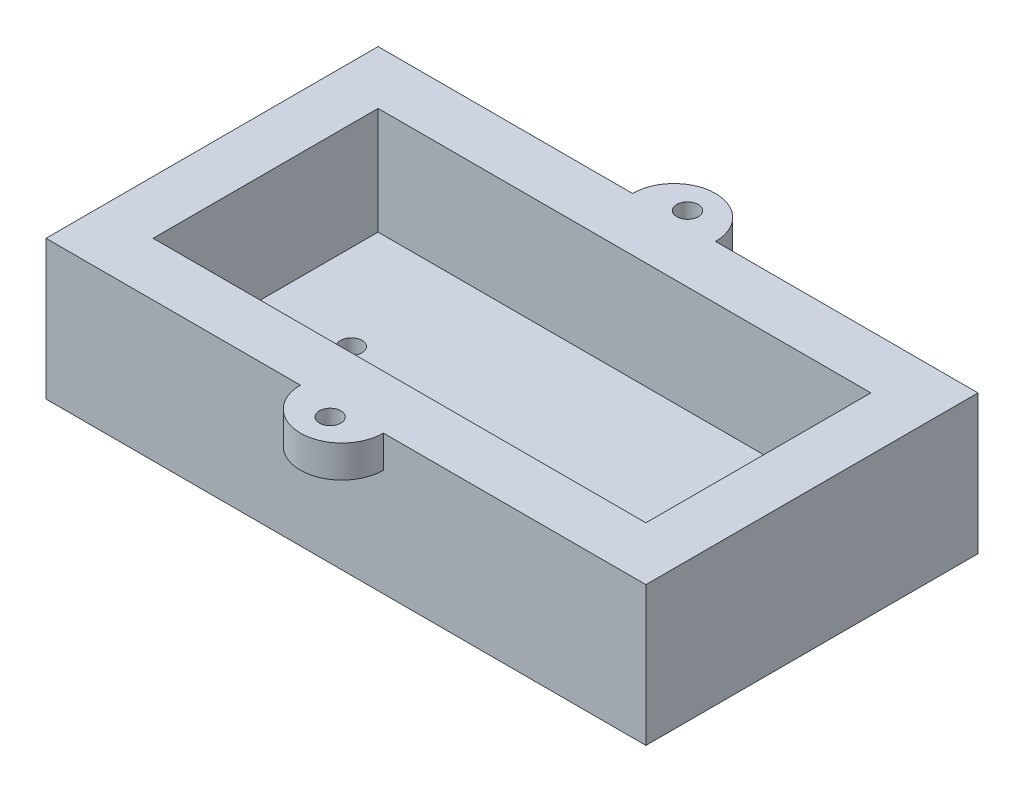
ISO-10303-21;
HEADER;
FILE_DESCRIPTION(('STEP AP214'),'2;1');
FILE_NAME('part.step','',(''),(''),'','','');
FILE_SCHEMA(('AUTOMOTIVE_DESIGN { 1 0 10303 214 1 1 1 1 }'));
ENDSEC;
DATA;
#1=APPLICATION_CONTEXT('core data for automotive mechanical design processes');
#2=APPLICATION_PROTOCOL_DEFINITION('international standard','automotive_design',2000,#1);
#3=PRODUCT_CONTEXT('',#1,'mechanical');
#4=PRODUCT('Part','Part','',(#3));
#5=PRODUCT_RELATED_PRODUCT_CATEGORY('part','',(#4));
#6=PRODUCT_DEFINITION_FORMATION('','',#4);
#7=PRODUCT_DEFINITION_CONTEXT('part definition',#1,'design');
#8=PRODUCT_DEFINITION('design','',#6,#7);
#9=PRODUCT_DEFINITION_SHAPE('','',#8);
#10=(LENGTH_UNIT() NAMED_UNIT(*) SI_UNIT(.MILLI.,.METRE.));
#11=(NAMED_UNIT(*) PLANE_ANGLE_UNIT() SI_UNIT($,.RADIAN.));
#12=(NAMED_UNIT(*) SI_UNIT($,.STERADIAN.) SOLID_ANGLE_UNIT());
#13=UNCERTAINTY_MEASURE_WITH_UNIT(LENGTH_MEASURE(1.E-05),#10,'distance_accuracy_value','');
#14=(GEOMETRIC_REPRESENTATION_CONTEXT(3) GLOBAL_UNCERTAINTY_ASSIGNED_CONTEXT((#13)) GLOBAL_UNIT_ASSIGNED_CONTEXT((#10,
#11,#12)) REPRESENTATION_CONTEXT('',''));
#15=CARTESIAN_POINT('',(0.,0.,0.));
#16=DIRECTION('',(0.,0.,1.));
#17=DIRECTION('',(1.,0.,0.));
#18=AXIS2_PLACEMENT_3D('',#15,#16,#17);
#19=CARTESIAN_POINT('',(0.,3.,0.));
#20=DIRECTION('',(0.,-1.,0.));
#21=DIRECTION('',(0.,0.,-1.));
#22=AXIS2_PLACEMENT_3D('',#19,#20,#21);
#23=PLANE('',#22);
#24=CARTESIAN_POINT('',(-9.8360655737705,3.,-4.66393442622951));
#25=DIRECTION('',(0.,1.,0.));
#26=DIRECTION('',(0.,0.,1.));
#27=AXIS2_PLACEMENT_3D('',#24,#25,#26);
#28=CIRCLE('',#27,1.);
#29=CARTESIAN_POINT('',(-9.8360655737705,3.,-3.66393442622951));
#30=VERTEX_POINT('',#29);
#31=EDGE_CURVE('E219',#30,#30,#28,.T.);
#32=ORIENTED_EDGE('',*,*,#31,.F.);
#33=EDGE_LOOP('',(#32));
#34=FACE_BOUND('',#33,.T.);
#35=CARTESIAN_POINT('',(20.1639344262295,3.,-4.66393442622952));
#36=DIRECTION('',(0.,1.,0.));
#37=DIRECTION('',(0.,0.,-1.));
#38=AXIS2_PLACEMENT_3D('',#35,#36,#37);
#39=CIRCLE('',#38,1.);
#40=CARTESIAN_POINT('',(20.1639344262295,3.,-5.66393442622952));
#41=VERTEX_POINT('',#40);
#42=EDGE_CURVE('E225',#41,#41,#39,.T.);
#43=ORIENTED_EDGE('',*,*,#42,.F.);
#44=EDGE_LOOP('',(#43));
#45=FACE_BOUND('',#44,.T.);
#46=DIRECTION('',(1.,0.,0.));
#47=VECTOR('',#46,1.);
#48=CARTESIAN_POINT('',(-17.8360655737705,3.,5.83606557377048));
#49=LINE('',#48,#47);
#50=CARTESIAN_POINT('',(-17.8360655737705,3.,5.83606557377048));
#51=VERTEX_POINT('',#50);
#52=CARTESIAN_POINT('',(28.1639344262295,3.,5.83606557377048));
#53=VERTEX_POINT('',#52);
#54=EDGE_CURVE('E211',#51,#53,#49,.T.);
#55=ORIENTED_EDGE('',*,*,#54,.T.);
#56=DIRECTION('',(0.,0.,1.));
#57=VECTOR('',#56,1.);
#58=CARTESIAN_POINT('',(28.1639344262295,3.,-15.1639344262295));
#59=LINE('',#58,#57);
#60=CARTESIAN_POINT('',(28.1639344262295,3.,-15.1639344262295));
#61=VERTEX_POINT('',#60);
#62=EDGE_CURVE('E213',#61,#53,#59,.T.);
#63=ORIENTED_EDGE('',*,*,#62,.F.);
#64=DIRECTION('',(1.,0.,0.));
#65=VECTOR('',#64,1.);
#66=CARTESIAN_POINT('',(-17.8360655737705,3.,-15.1639344262295));
#67=LINE('',#66,#65);
#68=CARTESIAN_POINT('',(-17.8360655737705,3.,-15.1639344262295));
#69=VERTEX_POINT('',#68);
#70=EDGE_CURVE('E47',#69,#61,#67,.T.);
#71=ORIENTED_EDGE('',*,*,#70,.F.);
#72=DIRECTION('',(0.,0.,1.));
#73=VECTOR('',#72,1.);
#74=CARTESIAN_POINT('',(-17.8360655737705,3.,-15.1639344262295));
#75=LINE('',#74,#73);
#76=EDGE_CURVE('E11',#69,#51,#75,.T.);
#77=ORIENTED_EDGE('',*,*,#76,.T.);
#78=EDGE_LOOP('',(#55,#63,#71,#77));
#79=FACE_BOUND('',#78,.T.);
#80=ADVANCED_FACE('F38',(#34,#45,#79),#23,.F.);
#81=CARTESIAN_POINT('',(-17.8360655737705,13.,-15.1639344262295));
#82=DIRECTION('',(1.,0.,0.));
#83=DIRECTION('',(0.,0.,-1.));
#84=AXIS2_PLACEMENT_3D('',#81,#82,#83);
#85=PLANE('',#84);
#86=ORIENTED_EDGE('',*,*,#76,.F.);
#87=DIRECTION('',(0.,-1.,0.));
#88=VECTOR('',#87,1.);
#89=CARTESIAN_POINT('',(-17.8360655737705,13.,-15.1639344262295));
#90=LINE('',#89,#88);
#91=CARTESIAN_POINT('',(-17.8360655737705,13.,-15.1639344262295));
#92=VERTEX_POINT('',#91);
#93=EDGE_CURVE('E168',#92,#69,#90,.T.);
#94=ORIENTED_EDGE('',*,*,#93,.F.);
#95=DIRECTION('',(0.,0.,1.));
#96=VECTOR('',#95,1.);
#97=CARTESIAN_POINT('',(-17.8360655737705,13.,-15.1639344262295));
#98=LINE('',#97,#96);
#99=CARTESIAN_POINT('',(-17.8360655737705,13.,5.83606557377048));
#100=VERTEX_POINT('',#99);
#101=EDGE_CURVE('E158',#92,#100,#98,.T.);
#102=ORIENTED_EDGE('',*,*,#101,.T.);
#103=DIRECTION('',(0.,-1.,0.));
#104=VECTOR('',#103,1.);
#105=CARTESIAN_POINT('',(-17.8360655737705,13.,5.83606557377048));
#106=LINE('',#105,#104);
#107=EDGE_CURVE('E177',#100,#51,#106,.T.);
#108=ORIENTED_EDGE('',*,*,#107,.T.);
#109=EDGE_LOOP('',(#86,#94,#102,#108));
#110=FACE_BOUND('',#109,.T.);
#111=ADVANCED_FACE('F271',(#110),#85,.T.);
#112=CARTESIAN_POINT('',(-17.8360655737705,13.,5.83606557377048));
#113=DIRECTION('',(0.,0.,-1.));
#114=DIRECTION('',(-1.,0.,0.));
#115=AXIS2_PLACEMENT_3D('',#112,#113,#114);
#116=PLANE('',#115);
#117=ORIENTED_EDGE('',*,*,#54,.F.);
#118=ORIENTED_EDGE('',*,*,#107,.F.);
#119=DIRECTION('',(1.,0.,0.));
#120=VECTOR('',#119,1.);
#121=CARTESIAN_POINT('',(-17.8360655737705,13.,5.83606557377048));
#122=LINE('',#121,#120);
#123=CARTESIAN_POINT('',(28.1639344262295,13.,5.83606557377048));
#124=VERTEX_POINT('',#123);
#125=EDGE_CURVE('E161',#100,#124,#122,.T.);
#126=ORIENTED_EDGE('',*,*,#125,.T.);
#127=DIRECTION('',(0.,-1.,0.));
#128=VECTOR('',#127,1.);
#129=CARTESIAN_POINT('',(28.1639344262295,13.,5.83606557377048));
#130=LINE('',#129,#128);
#131=EDGE_CURVE('E174',#124,#53,#130,.T.);
#132=ORIENTED_EDGE('',*,*,#131,.T.);
#133=EDGE_LOOP('',(#117,#118,#126,#132));
#134=FACE_BOUND('',#133,.T.);
#135=ADVANCED_FACE('F263',(#134),#116,.T.);
#136=CARTESIAN_POINT('',(28.1639344262295,13.,-15.1639344262295));
#137=DIRECTION('',(-1.,0.,0.));
#138=DIRECTION('',(0.,0.,1.));
#139=AXIS2_PLACEMENT_3D('',#136,#137,#138);
#140=PLANE('',#139);
#141=ORIENTED_EDGE('',*,*,#62,.T.);
#142=ORIENTED_EDGE('',*,*,#131,.F.);
#143=DIRECTION('',(0.,0.,-1.));
#144=VECTOR('',#143,1.);
#145=CARTESIAN_POINT('',(28.1639344262295,13.,-15.1639344262295));
#146=LINE('',#145,#144);
#147=CARTESIAN_POINT('',(28.1639344262295,13.,-15.1639344262295));
#148=VERTEX_POINT('',#147);
#149=EDGE_CURVE('E163',#124,#148,#146,.T.);
#150=ORIENTED_EDGE('',*,*,#149,.T.);
#151=DIRECTION('',(0.,-1.,0.));
#152=VECTOR('',#151,1.);
#153=CARTESIAN_POINT('',(28.1639344262295,13.,-15.1639344262295));
#154=LINE('',#153,#152);
#155=EDGE_CURVE('E171',#148,#61,#154,.T.);
#156=ORIENTED_EDGE('',*,*,#155,.T.);
#157=EDGE_LOOP('',(#141,#142,#150,#156));
#158=FACE_BOUND('',#157,.T.);
#159=ADVANCED_FACE('F265',(#158),#140,.T.);
#160=CARTESIAN_POINT('',(-17.8360655737705,13.,-15.1639344262295));
#161=DIRECTION('',(0.,0.,1.));
#162=DIRECTION('',(1.,0.,0.));
#163=AXIS2_PLACEMENT_3D('',#160,#161,#162);
#164=PLANE('',#163);
#165=ORIENTED_EDGE('',*,*,#70,.T.);
#166=ORIENTED_EDGE('',*,*,#155,.F.);
#167=DIRECTION('',(-1.,0.,0.));
#168=VECTOR('',#167,1.);
#169=CARTESIAN_POINT('',(-17.8360655737705,13.,-15.1639344262295));
#170=LINE('',#169,#168);
#171=EDGE_CURVE('E166',#148,#92,#170,.T.);
#172=ORIENTED_EDGE('',*,*,#171,.T.);
#173=ORIENTED_EDGE('',*,*,#93,.T.);
#174=EDGE_LOOP('',(#165,#166,#172,#173));
#175=FACE_BOUND('',#174,.T.);
#176=ADVANCED_FACE('F249',(#175),#164,.T.);
#177=CARTESIAN_POINT('',(0.,13.,0.));
#178=DIRECTION('',(0.,1.,0.));
#179=DIRECTION('',(0.,0.,1.));
#180=AXIS2_PLACEMENT_3D('',#177,#178,#179);
#181=PLANE('',#180);
#182=CARTESIAN_POINT('',(4.86912384209859,13.,-21.3454881289863));
#183=DIRECTION('',(0.,1.,0.));
#184=DIRECTION('',(0.,0.,1.));
#185=AXIS2_PLACEMENT_3D('',#182,#183,#184);
#186=CIRCLE('',#185,1.);
#187=CARTESIAN_POINT('',(4.86912384209859,13.,-20.3454881289863));
#188=VERTEX_POINT('',#187);
#189=EDGE_CURVE('E235',#188,#188,#186,.T.);
#190=ORIENTED_EDGE('',*,*,#189,.F.);
#191=EDGE_LOOP('',(#190));
#192=FACE_BOUND('',#191,.T.);
#193=CARTESIAN_POINT('',(4.86912384209859,13.,12.0176192765273));
#194=DIRECTION('',(0.,1.,0.));
#195=DIRECTION('',(0.,0.,-1.));
#196=AXIS2_PLACEMENT_3D('',#193,#194,#195);
#197=CIRCLE('',#196,1.);
#198=CARTESIAN_POINT('',(4.86912384209859,13.,11.0176192765273));
#199=VERTEX_POINT('',#198);
#200=EDGE_CURVE('E223',#199,#199,#197,.T.);
#201=ORIENTED_EDGE('',*,*,#200,.F.);
#202=EDGE_LOOP('',(#201));
#203=FACE_BOUND('',#202,.T.);
#204=DIRECTION('',(0.,0.,1.));
#205=VECTOR('',#204,1.);
#206=CARTESIAN_POINT('',(-22.8360655737705,13.,-20.1639344262295));
#207=LINE('',#206,#205);
#208=CARTESIAN_POINT('',(-22.8360655737705,13.,-20.1639344262295));
#209=VERTEX_POINT('',#208);
#210=CARTESIAN_POINT('',(-22.8360655737705,13.,10.8360655737705));
#211=VERTEX_POINT('',#210);
#212=EDGE_CURVE('E181',#209,#211,#207,.T.);
#213=ORIENTED_EDGE('',*,*,#212,.T.);
#214=DIRECTION('',(1.,0.,0.));
#215=VECTOR('',#214,1.);
#216=CARTESIAN_POINT('',(-22.8360655737705,13.,10.8360655737705));
#217=LINE('',#216,#215);
#218=CARTESIAN_POINT('',(0.913554245757848,13.,10.8360655737705));
#219=VERTEX_POINT('',#218);
#220=EDGE_CURVE('E185',#211,#219,#217,.T.);
#221=ORIENTED_EDGE('',*,*,#220,.T.);
#222=CARTESIAN_POINT('',(4.78890088089376,13.,10.8360655737705));
#223=DIRECTION('',(0.,1.,0.));
#224=DIRECTION('',(0.,0.,1.));
#225=AXIS2_PLACEMENT_3D('',#222,#223,#224);
#226=CIRCLE('',#225,3.87534663513591);
#227=CARTESIAN_POINT('',(8.66424751602968,13.,10.8360655737705));
#228=VERTEX_POINT('',#227);
#229=EDGE_CURVE('E55',#219,#228,#226,.T.);
#230=ORIENTED_EDGE('',*,*,#229,.T.);
#231=CARTESIAN_POINT('',(33.1639344262295,13.,10.8360655737705));
#232=VERTEX_POINT('',#231);
#233=EDGE_CURVE('E143',#228,#232,#217,.T.);
#234=ORIENTED_EDGE('',*,*,#233,.T.);
#235=DIRECTION('',(0.,0.,-1.));
#236=VECTOR('',#235,1.);
#237=CARTESIAN_POINT('',(33.1639344262295,13.,-20.1639344262295));
#238=LINE('',#237,#236);
#239=CARTESIAN_POINT('',(33.1639344262295,13.,-20.1639344262295));
#240=VERTEX_POINT('',#239);
#241=EDGE_CURVE('E187',#232,#240,#238,.T.);
#242=ORIENTED_EDGE('',*,*,#241,.T.);
#243=DIRECTION('',(-1.,0.,0.));
#244=VECTOR('',#243,1.);
#245=CARTESIAN_POINT('',(-22.8360655737705,13.,-20.1639344262295));
#246=LINE('',#245,#244);
#247=CARTESIAN_POINT('',(8.66424751602968,13.,-20.1639344262295));
#248=VERTEX_POINT('',#247);
#249=EDGE_CURVE('E190',#240,#248,#246,.T.);
#250=ORIENTED_EDGE('',*,*,#249,.T.);
#251=CARTESIAN_POINT('',(4.78890088089376,13.,-20.1639344262295));
#252=DIRECTION('',(0.,1.,0.));
#253=DIRECTION('',(0.,0.,-1.));
#254=AXIS2_PLACEMENT_3D('',#251,#252,#253);
#255=CIRCLE('',#254,3.87534663513591);
#256=CARTESIAN_POINT('',(0.913554245757848,13.,-20.1639344262295));
#257=VERTEX_POINT('',#256);
#258=EDGE_CURVE('E62',#248,#257,#255,.T.);
#259=ORIENTED_EDGE('',*,*,#258,.T.);
#260=EDGE_CURVE('E189',#257,#209,#246,.T.);
#261=ORIENTED_EDGE('',*,*,#260,.T.);
#262=EDGE_LOOP('',(#213,#221,#230,#234,#242,#250,#259,#261));
#263=FACE_BOUND('',#262,.T.);
#264=ORIENTED_EDGE('',*,*,#125,.F.);
#265=ORIENTED_EDGE('',*,*,#101,.F.);
#266=ORIENTED_EDGE('',*,*,#171,.F.);
#267=ORIENTED_EDGE('',*,*,#149,.F.);
#268=EDGE_LOOP('',(#264,#265,#266,#267));
#269=FACE_BOUND('',#268,.T.);
#270=ADVANCED_FACE('F246',(#192,#203,#263,#269),#181,.T.);
#271=CARTESIAN_POINT('',(-22.8360655737705,13.,-20.1639344262295));
#272=DIRECTION('',(1.,0.,0.));
#273=DIRECTION('',(0.,0.,-1.));
#274=AXIS2_PLACEMENT_3D('',#271,#272,#273);
#275=PLANE('',#274);
#276=DIRECTION('',(0.,0.,1.));
#277=VECTOR('',#276,1.);
#278=CARTESIAN_POINT('',(-22.8360655737705,0.,-20.1639344262295));
#279=LINE('',#278,#277);
#280=CARTESIAN_POINT('',(-22.8360655737705,0.,-20.1639344262295));
#281=VERTEX_POINT('',#280);
#282=CARTESIAN_POINT('',(-22.8360655737705,0.,10.8360655737705));
#283=VERTEX_POINT('',#282);
#284=EDGE_CURVE('E180',#281,#283,#279,.T.);
#285=ORIENTED_EDGE('',*,*,#284,.T.);
#286=DIRECTION('',(0.,-1.,0.));
#287=VECTOR('',#286,1.);
#288=CARTESIAN_POINT('',(-22.8360655737705,13.,10.8360655737705));
#289=LINE('',#288,#287);
#290=EDGE_CURVE('E208',#211,#283,#289,.T.);
#291=ORIENTED_EDGE('',*,*,#290,.F.);
#292=ORIENTED_EDGE('',*,*,#212,.F.);
#293=DIRECTION('',(0.,-1.,0.));
#294=VECTOR('',#293,1.);
#295=CARTESIAN_POINT('',(-22.8360655737705,13.,-20.1639344262295));
#296=LINE('',#295,#294);
#297=EDGE_CURVE('E192',#209,#281,#296,.T.);
#298=ORIENTED_EDGE('',*,*,#297,.T.);
#299=EDGE_LOOP('',(#285,#291,#292,#298));
#300=FACE_BOUND('',#299,.T.);
#301=ADVANCED_FACE('F248',(#300),#275,.F.);
#302=CARTESIAN_POINT('',(-22.8360655737705,13.,10.8360655737705));
#303=DIRECTION('',(0.,0.,-1.));
#304=DIRECTION('',(-1.,0.,0.));
#305=AXIS2_PLACEMENT_3D('',#302,#303,#304);
#306=PLANE('',#305);
#307=DIRECTION('',(-1.,0.,0.));
#308=VECTOR('',#307,1.);
#309=CARTESIAN_POINT('',(0.913554245757848,10.,10.8360655737705));
#310=LINE('',#309,#308);
#311=CARTESIAN_POINT('',(8.66424751602968,10.,10.8360655737705));
#312=VERTEX_POINT('',#311);
#313=CARTESIAN_POINT('',(0.913554245757848,10.,10.8360655737705));
#314=VERTEX_POINT('',#313);
#315=EDGE_CURVE('E136',#312,#314,#310,.T.);
#316=ORIENTED_EDGE('',*,*,#315,.T.);
#317=DIRECTION('',(0.,1.,0.));
#318=VECTOR('',#317,1.);
#319=CARTESIAN_POINT('',(0.913554245757848,10.,10.8360655737705));
#320=LINE('',#319,#318);
#321=EDGE_CURVE('E133',#314,#219,#320,.T.);
#322=ORIENTED_EDGE('',*,*,#321,.T.);
#323=ORIENTED_EDGE('',*,*,#220,.F.);
#324=ORIENTED_EDGE('',*,*,#290,.T.);
#325=DIRECTION('',(1.,0.,0.));
#326=VECTOR('',#325,1.);
#327=CARTESIAN_POINT('',(-22.8360655737705,0.,10.8360655737705));
#328=LINE('',#327,#326);
#329=CARTESIAN_POINT('',(33.1639344262295,0.,10.8360655737705));
#330=VERTEX_POINT('',#329);
#331=EDGE_CURVE('E195',#283,#330,#328,.T.);
#332=ORIENTED_EDGE('',*,*,#331,.T.);
#333=DIRECTION('',(0.,-1.,0.));
#334=VECTOR('',#333,1.);
#335=CARTESIAN_POINT('',(33.1639344262295,13.,10.8360655737705));
#336=LINE('',#335,#334);
#337=EDGE_CURVE('E205',#232,#330,#336,.T.);
#338=ORIENTED_EDGE('',*,*,#337,.F.);
#339=ORIENTED_EDGE('',*,*,#233,.F.);
#340=DIRECTION('',(0.,1.,0.));
#341=VECTOR('',#340,1.);
#342=CARTESIAN_POINT('',(8.66424751602968,10.,10.8360655737705));
#343=LINE('',#342,#341);
#344=EDGE_CURVE('E130',#312,#228,#343,.T.);
#345=ORIENTED_EDGE('',*,*,#344,.F.);
#346=EDGE_LOOP('',(#316,#322,#323,#324,#332,#338,#339,#345));
#347=FACE_BOUND('',#346,.T.);
#348=ADVANCED_FACE('F141',(#347),#306,.F.);
#349=CARTESIAN_POINT('',(33.1639344262295,13.,-20.1639344262295));
#350=DIRECTION('',(-1.,0.,0.));
#351=DIRECTION('',(0.,0.,1.));
#352=AXIS2_PLACEMENT_3D('',#349,#350,#351);
#353=PLANE('',#352);
#354=DIRECTION('',(0.,0.,-1.));
#355=VECTOR('',#354,1.);
#356=CARTESIAN_POINT('',(33.1639344262295,0.,-20.1639344262295));
#357=LINE('',#356,#355);
#358=CARTESIAN_POINT('',(33.1639344262295,0.,-20.1639344262295));
#359=VERTEX_POINT('',#358);
#360=EDGE_CURVE('E197',#330,#359,#357,.T.);
#361=ORIENTED_EDGE('',*,*,#360,.T.);
#362=DIRECTION('',(0.,-1.,0.));
#363=VECTOR('',#362,1.);
#364=CARTESIAN_POINT('',(33.1639344262295,13.,-20.1639344262295));
#365=LINE('',#364,#363);
#366=EDGE_CURVE('E202',#240,#359,#365,.T.);
#367=ORIENTED_EDGE('',*,*,#366,.F.);
#368=ORIENTED_EDGE('',*,*,#241,.F.);
#369=ORIENTED_EDGE('',*,*,#337,.T.);
#370=EDGE_LOOP('',(#361,#367,#368,#369));
#371=FACE_BOUND('',#370,.T.);
#372=ADVANCED_FACE('F285',(#371),#353,.F.);
#373=CARTESIAN_POINT('',(-22.8360655737705,13.,-20.1639344262295));
#374=DIRECTION('',(0.,0.,1.));
#375=DIRECTION('',(1.,0.,0.));
#376=AXIS2_PLACEMENT_3D('',#373,#374,#375);
#377=PLANE('',#376);
#378=DIRECTION('',(1.,0.,0.));
#379=VECTOR('',#378,1.);
#380=CARTESIAN_POINT('',(0.913554245757848,10.,-20.1639344262295));
#381=LINE('',#380,#379);
#382=CARTESIAN_POINT('',(0.913554245757848,10.,-20.1639344262295));
#383=VERTEX_POINT('',#382);
#384=CARTESIAN_POINT('',(8.66424751602968,10.,-20.1639344262295));
#385=VERTEX_POINT('',#384);
#386=EDGE_CURVE('E150',#383,#385,#381,.T.);
#387=ORIENTED_EDGE('',*,*,#386,.T.);
#388=DIRECTION('',(0.,1.,0.));
#389=VECTOR('',#388,1.);
#390=CARTESIAN_POINT('',(8.66424751602968,10.,-20.1639344262295));
#391=LINE('',#390,#389);
#392=EDGE_CURVE('E155',#385,#248,#391,.T.);
#393=ORIENTED_EDGE('',*,*,#392,.T.);
#394=ORIENTED_EDGE('',*,*,#249,.F.);
#395=ORIENTED_EDGE('',*,*,#366,.T.);
#396=DIRECTION('',(-1.,0.,0.));
#397=VECTOR('',#396,1.);
#398=CARTESIAN_POINT('',(-22.8360655737705,0.,-20.1639344262295));
#399=LINE('',#398,#397);
#400=EDGE_CURVE('E184',#359,#281,#399,.T.);
#401=ORIENTED_EDGE('',*,*,#400,.T.);
#402=ORIENTED_EDGE('',*,*,#297,.F.);
#403=ORIENTED_EDGE('',*,*,#260,.F.);
#404=DIRECTION('',(0.,1.,0.));
#405=VECTOR('',#404,1.);
#406=CARTESIAN_POINT('',(0.913554245757848,10.,-20.1639344262295));
#407=LINE('',#406,#405);
#408=EDGE_CURVE('E153',#383,#257,#407,.T.);
#409=ORIENTED_EDGE('',*,*,#408,.F.);
#410=EDGE_LOOP('',(#387,#393,#394,#395,#401,#402,#403,#409));
#411=FACE_BOUND('',#410,.T.);
#412=ADVANCED_FACE('F282',(#411),#377,.F.);
#413=CARTESIAN_POINT('',(0.,0.,0.));
#414=DIRECTION('',(0.,-1.,0.));
#415=DIRECTION('',(0.,0.,-1.));
#416=AXIS2_PLACEMENT_3D('',#413,#414,#415);
#417=PLANE('',#416);
#418=CARTESIAN_POINT('',(-9.8360655737705,0.,-4.66393442622951));
#419=DIRECTION('',(0.,-1.,0.));
#420=DIRECTION('',(0.,0.,-1.));
#421=AXIS2_PLACEMENT_3D('',#418,#419,#420);
#422=CIRCLE('',#421,1.);
#423=CARTESIAN_POINT('',(-9.8360655737705,0.,-5.66393442622951));
#424=VERTEX_POINT('',#423);
#425=EDGE_CURVE('E42',#424,#424,#422,.T.);
#426=ORIENTED_EDGE('',*,*,#425,.F.);
#427=EDGE_LOOP('',(#426));
#428=FACE_BOUND('',#427,.T.);
#429=CARTESIAN_POINT('',(20.1639344262295,0.,-4.66393442622952));
#430=DIRECTION('',(0.,-1.,0.));
#431=DIRECTION('',(0.,0.,-1.));
#432=AXIS2_PLACEMENT_3D('',#429,#430,#431);
#433=CIRCLE('',#432,1.);
#434=CARTESIAN_POINT('',(20.1639344262295,0.,-5.66393442622952));
#435=VERTEX_POINT('',#434);
#436=EDGE_CURVE('E217',#435,#435,#433,.T.);
#437=ORIENTED_EDGE('',*,*,#436,.F.);
#438=EDGE_LOOP('',(#437));
#439=FACE_BOUND('',#438,.T.);
#440=ORIENTED_EDGE('',*,*,#284,.F.);
#441=ORIENTED_EDGE('',*,*,#400,.F.);
#442=ORIENTED_EDGE('',*,*,#360,.F.);
#443=ORIENTED_EDGE('',*,*,#331,.F.);
#444=EDGE_LOOP('',(#440,#441,#442,#443));
#445=FACE_BOUND('',#444,.T.);
#446=ADVANCED_FACE('F40',(#428,#439,#445),#417,.T.);
#447=CARTESIAN_POINT('',(4.78890088089376,10.,-20.1639344262295));
#448=DIRECTION('',(0.,1.,0.));
#449=DIRECTION('',(0.,0.,1.));
#450=AXIS2_PLACEMENT_3D('',#447,#448,#449);
#451=CYLINDRICAL_SURFACE('',#450,3.87534663513591);
#452=ORIENTED_EDGE('',*,*,#258,.F.);
#453=ORIENTED_EDGE('',*,*,#392,.F.);
#454=CARTESIAN_POINT('',(4.78890088089376,10.,-20.1639344262295));
#455=DIRECTION('',(0.,1.,0.));
#456=DIRECTION('',(0.,0.,-1.));
#457=AXIS2_PLACEMENT_3D('',#454,#455,#456);
#458=CIRCLE('',#457,3.87534663513591);
#459=EDGE_CURVE('E148',#385,#383,#458,.T.);
#460=ORIENTED_EDGE('',*,*,#459,.T.);
#461=ORIENTED_EDGE('',*,*,#408,.T.);
#462=EDGE_LOOP('',(#452,#453,#460,#461));
#463=FACE_BOUND('',#462,.T.);
#464=ADVANCED_FACE('F308',(#463),#451,.T.);
#465=CARTESIAN_POINT('',(4.78890088089376,10.,-20.1639344262295));
#466=DIRECTION('',(0.,-1.,0.));
#467=DIRECTION('',(0.,0.,-1.));
#468=AXIS2_PLACEMENT_3D('',#465,#466,#467);
#469=PLANE('',#468);
#470=ORIENTED_EDGE('',*,*,#459,.F.);
#471=ORIENTED_EDGE('',*,*,#386,.F.);
#472=EDGE_LOOP('',(#470,#471));
#473=FACE_BOUND('',#472,.T.);
#474=ADVANCED_FACE('F310',(#473),#469,.T.);
#475=CARTESIAN_POINT('',(4.78890088089376,10.,10.8360655737705));
#476=DIRECTION('',(0.,1.,0.));
#477=DIRECTION('',(0.,0.,1.));
#478=AXIS2_PLACEMENT_3D('',#475,#476,#477);
#479=CYLINDRICAL_SURFACE('',#478,3.87534663513591);
#480=ORIENTED_EDGE('',*,*,#229,.F.);
#481=ORIENTED_EDGE('',*,*,#321,.F.);
#482=CARTESIAN_POINT('',(4.78890088089376,10.,10.8360655737705));
#483=DIRECTION('',(0.,1.,0.));
#484=DIRECTION('',(0.,0.,1.));
#485=AXIS2_PLACEMENT_3D('',#482,#483,#484);
#486=CIRCLE('',#485,3.87534663513591);
#487=EDGE_CURVE('E126',#314,#312,#486,.T.);
#488=ORIENTED_EDGE('',*,*,#487,.T.);
#489=ORIENTED_EDGE('',*,*,#344,.T.);
#490=EDGE_LOOP('',(#480,#481,#488,#489));
#491=FACE_BOUND('',#490,.T.);
#492=ADVANCED_FACE('F128',(#491),#479,.T.);
#493=CARTESIAN_POINT('',(4.78890088089376,10.,10.8360655737705));
#494=DIRECTION('',(0.,1.,0.));
#495=DIRECTION('',(0.,0.,1.));
#496=AXIS2_PLACEMENT_3D('',#493,#494,#495);
#497=PLANE('',#496);
#498=ORIENTED_EDGE('',*,*,#487,.F.);
#499=ORIENTED_EDGE('',*,*,#315,.F.);
#500=EDGE_LOOP('',(#498,#499));
#501=FACE_BOUND('',#500,.T.);
#502=ADVANCED_FACE('F138',(#501),#497,.F.);
#503=CARTESIAN_POINT('',(4.86912384209859,11.5,12.0176192765273));
#504=DIRECTION('',(0.,1.,0.));
#505=DIRECTION('',(0.,0.,1.));
#506=AXIS2_PLACEMENT_3D('',#503,#504,#505);
#507=CYLINDRICAL_SURFACE('',#506,1.);
#508=CARTESIAN_POINT('',(4.86912384209859,11.5,12.0176192765273));
#509=DIRECTION('',(0.,1.,0.));
#510=DIRECTION('',(0.,0.,-1.));
#511=AXIS2_PLACEMENT_3D('',#508,#509,#510);
#512=CIRCLE('',#511,1.);
#513=CARTESIAN_POINT('',(4.86912384209859,11.5,11.0176192765273));
#514=VERTEX_POINT('',#513);
#515=EDGE_CURVE('E238',#514,#514,#512,.T.);
#516=ORIENTED_EDGE('',*,*,#515,.F.);
#517=EDGE_LOOP('',(#516));
#518=FACE_BOUND('',#517,.T.);
#519=ORIENTED_EDGE('',*,*,#200,.T.);
#520=EDGE_LOOP('',(#519));
#521=FACE_BOUND('',#520,.T.);
#522=ADVANCED_FACE('F244',(#518,#521),#507,.F.);
#523=CARTESIAN_POINT('',(4.86912384209859,11.5,12.0176192765273));
#524=DIRECTION('',(0.,-1.,0.));
#525=DIRECTION('',(0.,0.,-1.));
#526=AXIS2_PLACEMENT_3D('',#523,#524,#525);
#527=PLANE('',#526);
#528=ORIENTED_EDGE('',*,*,#515,.T.);
#529=EDGE_LOOP('',(#528));
#530=FACE_BOUND('',#529,.T.);
#531=ADVANCED_FACE('F352',(#530),#527,.F.);
#532=CARTESIAN_POINT('',(4.86912384209859,11.5,-21.3454881289863));
#533=DIRECTION('',(0.,1.,0.));
#534=DIRECTION('',(0.,0.,1.));
#535=AXIS2_PLACEMENT_3D('',#532,#533,#534);
#536=CYLINDRICAL_SURFACE('',#535,1.);
#537=CARTESIAN_POINT('',(4.86912384209859,11.5,-21.3454881289863));
#538=DIRECTION('',(0.,1.,0.));
#539=DIRECTION('',(0.,0.,1.));
#540=AXIS2_PLACEMENT_3D('',#537,#538,#539);
#541=CIRCLE('',#540,1.);
#542=CARTESIAN_POINT('',(4.86912384209859,11.5,-20.3454881289863));
#543=VERTEX_POINT('',#542);
#544=EDGE_CURVE('E232',#543,#543,#541,.T.);
#545=ORIENTED_EDGE('',*,*,#544,.F.);
#546=EDGE_LOOP('',(#545));
#547=FACE_BOUND('',#546,.T.);
#548=ORIENTED_EDGE('',*,*,#189,.T.);
#549=EDGE_LOOP('',(#548));
#550=FACE_BOUND('',#549,.T.);
#551=ADVANCED_FACE('F362',(#547,#550),#536,.F.);
#552=CARTESIAN_POINT('',(4.86912384209859,11.5,-21.3454881289863));
#553=DIRECTION('',(0.,1.,0.));
#554=DIRECTION('',(0.,0.,1.));
#555=AXIS2_PLACEMENT_3D('',#552,#553,#554);
#556=PLANE('',#555);
#557=ORIENTED_EDGE('',*,*,#544,.T.);
#558=EDGE_LOOP('',(#557));
#559=FACE_BOUND('',#558,.T.);
#560=ADVANCED_FACE('F372',(#559),#556,.T.);
#561=CARTESIAN_POINT('',(20.1639344262295,-2.,-4.66393442622952));
#562=DIRECTION('',(0.,1.,0.));
#563=DIRECTION('',(0.,0.,1.));
#564=AXIS2_PLACEMENT_3D('',#561,#562,#563);
#565=CYLINDRICAL_SURFACE('',#564,1.);
#566=ORIENTED_EDGE('',*,*,#436,.T.);
#567=EDGE_LOOP('',(#566));
#568=FACE_BOUND('',#567,.T.);
#569=ORIENTED_EDGE('',*,*,#42,.T.);
#570=EDGE_LOOP('',(#569));
#571=FACE_BOUND('',#570,.T.);
#572=ADVANCED_FACE('F382',(#568,#571),#565,.F.);
#573=CARTESIAN_POINT('',(-9.8360655737705,-2.,-4.66393442622951));
#574=DIRECTION('',(0.,1.,0.));
#575=DIRECTION('',(0.,0.,1.));
#576=AXIS2_PLACEMENT_3D('',#573,#574,#575);
#577=CYLINDRICAL_SURFACE('',#576,1.);
#578=ORIENTED_EDGE('',*,*,#425,.T.);
#579=EDGE_LOOP('',(#578));
#580=FACE_BOUND('',#579,.T.);
#581=ORIENTED_EDGE('',*,*,#31,.T.);
#582=EDGE_LOOP('',(#581));
#583=FACE_BOUND('',#582,.T.);
#584=ADVANCED_FACE('F408',(#580,#583),#577,.F.);
#585=CLOSED_SHELL('',(#80,#111,#135,#159,#176,#270,#301,#348,#372,#412,#446,#464,#474,#492,#502,
#522,#531,#551,#560,#572,#584));
#586=MANIFOLD_SOLID_BREP('B2',#585);
#587=ADVANCED_BREP_SHAPE_REPRESENTATION('',(#18,#586),#14);
#588=SHAPE_DEFINITION_REPRESENTATION(#9,#587);
ENDSEC;
END-ISO-10303-21;
